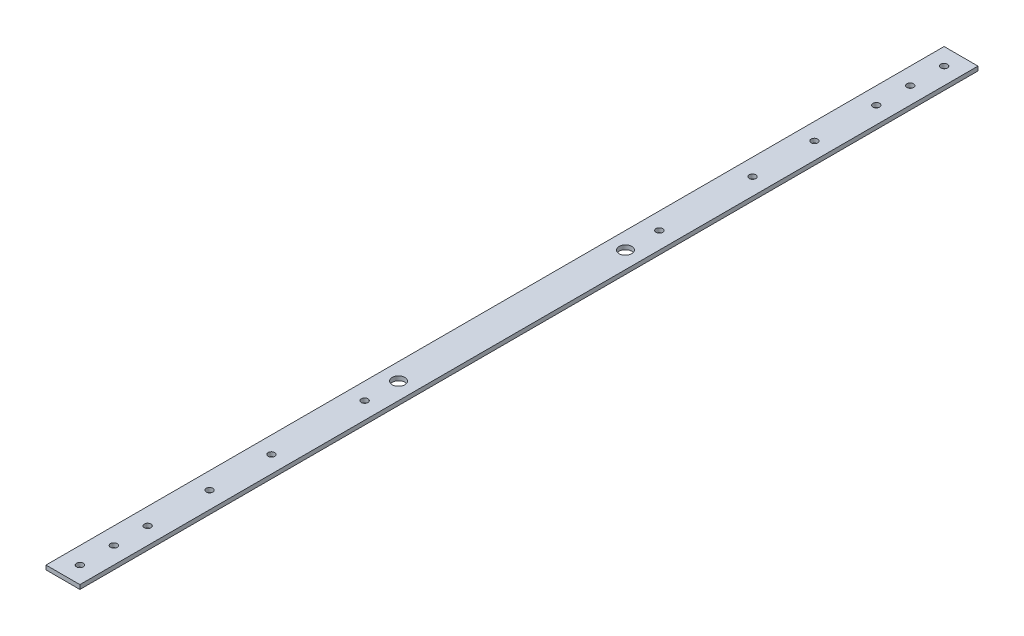
ISO-10303-21;
HEADER;
FILE_DESCRIPTION(('STEP AP214'),'2;1');
FILE_NAME('part.step','',(''),(''),'','','');
FILE_SCHEMA(('AUTOMOTIVE_DESIGN { 1 0 10303 214 1 1 1 1 }'));
ENDSEC;
DATA;
#1=APPLICATION_CONTEXT('core data for automotive mechanical design processes');
#2=APPLICATION_PROTOCOL_DEFINITION('international standard','automotive_design',2000,#1);
#3=PRODUCT_CONTEXT('',#1,'mechanical');
#4=PRODUCT('Part','Part','',(#3));
#5=PRODUCT_RELATED_PRODUCT_CATEGORY('part','',(#4));
#6=PRODUCT_DEFINITION_FORMATION('','',#4);
#7=PRODUCT_DEFINITION_CONTEXT('part definition',#1,'design');
#8=PRODUCT_DEFINITION('design','',#6,#7);
#9=PRODUCT_DEFINITION_SHAPE('','',#8);
#10=(LENGTH_UNIT() NAMED_UNIT(*) SI_UNIT(.MILLI.,.METRE.));
#11=(NAMED_UNIT(*) PLANE_ANGLE_UNIT() SI_UNIT($,.RADIAN.));
#12=(NAMED_UNIT(*) SI_UNIT($,.STERADIAN.) SOLID_ANGLE_UNIT());
#13=UNCERTAINTY_MEASURE_WITH_UNIT(LENGTH_MEASURE(1.E-05),#10,'distance_accuracy_value','');
#14=(GEOMETRIC_REPRESENTATION_CONTEXT(3) GLOBAL_UNCERTAINTY_ASSIGNED_CONTEXT((#13)) GLOBAL_UNIT_ASSIGNED_CONTEXT((#10,
#11,#12)) REPRESENTATION_CONTEXT('',''));
#15=CARTESIAN_POINT('',(0.,0.,0.));
#16=DIRECTION('',(0.,0.,1.));
#17=DIRECTION('',(1.,0.,0.));
#18=AXIS2_PLACEMENT_3D('',#15,#16,#17);
#19=CARTESIAN_POINT('',(31.7500000000001,500.126,-673.1));
#20=DIRECTION('',(0.,1.,0.));
#21=DIRECTION('',(-1.,0.,0.));
#22=AXIS2_PLACEMENT_3D('',#19,#20,#21);
#23=PLANE('',#22);
#24=DIRECTION('',(-1.,0.,0.));
#25=VECTOR('',#24,1.);
#26=CARTESIAN_POINT('',(31.7500000000001,500.126,0.));
#27=LINE('',#26,#25);
#28=CARTESIAN_POINT('',(57.1500000000001,500.126,0.));
#29=VERTEX_POINT('',#28);
#30=CARTESIAN_POINT('',(31.7500000000001,500.126,0.));
#31=VERTEX_POINT('',#30);
#32=EDGE_CURVE('E84',#29,#31,#27,.T.);
#33=ORIENTED_EDGE('',*,*,#32,.F.);
#34=DIRECTION('',(0.,0.,1.));
#35=VECTOR('',#34,1.);
#36=CARTESIAN_POINT('',(57.1500000000001,500.126,-673.1));
#37=LINE('',#36,#35);
#38=CARTESIAN_POINT('',(57.1500000000001,500.126,-673.1));
#39=VERTEX_POINT('',#38);
#40=EDGE_CURVE('E50',#39,#29,#37,.T.);
#41=ORIENTED_EDGE('',*,*,#40,.F.);
#42=DIRECTION('',(-1.,0.,0.));
#43=VECTOR('',#42,1.);
#44=CARTESIAN_POINT('',(31.7500000000001,500.126,-673.1));
#45=LINE('',#44,#43);
#46=CARTESIAN_POINT('',(31.7500000000001,500.126,-673.1));
#47=VERTEX_POINT('',#46);
#48=EDGE_CURVE('E86',#39,#47,#45,.T.);
#49=ORIENTED_EDGE('',*,*,#48,.T.);
#50=DIRECTION('',(0.,0.,1.));
#51=VECTOR('',#50,1.);
#52=CARTESIAN_POINT('',(31.7500000000001,500.126,-673.1));
#53=LINE('',#52,#51);
#54=EDGE_CURVE('E11',#47,#31,#53,.T.);
#55=ORIENTED_EDGE('',*,*,#54,.T.);
#56=EDGE_LOOP('',(#33,#41,#49,#55));
#57=FACE_BOUND('',#56,.T.);
#58=CARTESIAN_POINT('',(44.4500000000001,500.126,-226.1108));
#59=DIRECTION('',(0.,1.,0.));
#60=DIRECTION('',(-1.,0.,0.));
#61=AXIS2_PLACEMENT_3D('',#58,#59,#60);
#62=CIRCLE('',#61,2.48919999998114);
#63=CARTESIAN_POINT('',(41.9608000000189,500.126,-226.1108));
#64=VERTEX_POINT('',#63);
#65=EDGE_CURVE('E176',#64,#64,#62,.T.);
#66=ORIENTED_EDGE('',*,*,#65,.F.);
#67=EDGE_LOOP('',(#66));
#68=FACE_BOUND('',#67,.T.);
#69=CARTESIAN_POINT('',(44.4500000000001,500.126,-516.8392));
#70=DIRECTION('',(0.,1.,0.));
#71=DIRECTION('',(-1.,0.,0.));
#72=AXIS2_PLACEMENT_3D('',#69,#70,#71);
#73=CIRCLE('',#72,2.48919999999996);
#74=CARTESIAN_POINT('',(41.9608000000001,500.126,-516.8392));
#75=VERTEX_POINT('',#74);
#76=EDGE_CURVE('E180',#75,#75,#73,.T.);
#77=ORIENTED_EDGE('',*,*,#76,.F.);
#78=EDGE_LOOP('',(#77));
#79=FACE_BOUND('',#78,.T.);
#80=CARTESIAN_POINT('',(44.4500000000001,500.126,-446.9892));
#81=DIRECTION('',(0.,1.,0.));
#82=DIRECTION('',(-1.,0.,0.));
#83=AXIS2_PLACEMENT_3D('',#80,#81,#82);
#84=CIRCLE('',#83,2.4892);
#85=CARTESIAN_POINT('',(41.9608000000001,500.126,-446.9892));
#86=VERTEX_POINT('',#85);
#87=EDGE_CURVE('E184',#86,#86,#84,.T.);
#88=ORIENTED_EDGE('',*,*,#87,.F.);
#89=EDGE_LOOP('',(#88));
#90=FACE_BOUND('',#89,.T.);
#91=CARTESIAN_POINT('',(44.4500000000001,500.126,-63.5));
#92=DIRECTION('',(0.,1.,0.));
#93=DIRECTION('',(-1.,0.,0.));
#94=AXIS2_PLACEMENT_3D('',#91,#92,#93);
#95=CIRCLE('',#94,2.48919999998113);
#96=CARTESIAN_POINT('',(41.9608000000189,500.126,-63.5));
#97=VERTEX_POINT('',#96);
#98=EDGE_CURVE('E188',#97,#97,#95,.T.);
#99=ORIENTED_EDGE('',*,*,#98,.F.);
#100=EDGE_LOOP('',(#99));
#101=FACE_BOUND('',#100,.T.);
#102=CARTESIAN_POINT('',(44.4500000000001,500.126,-38.1));
#103=DIRECTION('',(0.,1.,0.));
#104=DIRECTION('',(-1.,0.,0.));
#105=AXIS2_PLACEMENT_3D('',#102,#103,#104);
#106=CIRCLE('',#105,2.48919999998114);
#107=CARTESIAN_POINT('',(41.9608000000189,500.126,-38.1));
#108=VERTEX_POINT('',#107);
#109=EDGE_CURVE('E167',#108,#108,#106,.T.);
#110=ORIENTED_EDGE('',*,*,#109,.F.);
#111=EDGE_LOOP('',(#110));
#112=FACE_BOUND('',#111,.T.);
#113=CARTESIAN_POINT('',(44.4500000000001,500.126,-660.4));
#114=DIRECTION('',(0.,1.,0.));
#115=DIRECTION('',(-1.,0.,0.));
#116=AXIS2_PLACEMENT_3D('',#113,#114,#115);
#117=CIRCLE('',#116,2.48919999999997);
#118=CARTESIAN_POINT('',(41.9608000000001,500.126,-660.4));
#119=VERTEX_POINT('',#118);
#120=EDGE_CURVE('E163',#119,#119,#117,.T.);
#121=ORIENTED_EDGE('',*,*,#120,.F.);
#122=EDGE_LOOP('',(#121));
#123=FACE_BOUND('',#122,.T.);
#124=CARTESIAN_POINT('',(44.4500000000001,500.126,-156.2608));
#125=DIRECTION('',(0.,1.,0.));
#126=DIRECTION('',(-1.,0.,0.));
#127=AXIS2_PLACEMENT_3D('',#124,#125,#126);
#128=CIRCLE('',#127,2.4892);
#129=CARTESIAN_POINT('',(41.9608000000001,500.126,-156.2608));
#130=VERTEX_POINT('',#129);
#131=EDGE_CURVE('E168',#130,#130,#128,.T.);
#132=ORIENTED_EDGE('',*,*,#131,.F.);
#133=EDGE_LOOP('',(#132));
#134=FACE_BOUND('',#133,.T.);
#135=CARTESIAN_POINT('',(44.4500000000001,500.126,-635.));
#136=DIRECTION('',(0.,1.,0.));
#137=DIRECTION('',(-1.,0.,0.));
#138=AXIS2_PLACEMENT_3D('',#135,#136,#137);
#139=CIRCLE('',#138,2.48919999999997);
#140=CARTESIAN_POINT('',(41.9608000000001,500.126,-635.));
#141=VERTEX_POINT('',#140);
#142=EDGE_CURVE('E172',#141,#141,#139,.T.);
#143=ORIENTED_EDGE('',*,*,#142,.F.);
#144=EDGE_LOOP('',(#143));
#145=FACE_BOUND('',#144,.T.);
#146=CARTESIAN_POINT('',(44.4500000000001,500.126,-609.6));
#147=DIRECTION('',(0.,1.,0.));
#148=DIRECTION('',(-1.,0.,0.));
#149=AXIS2_PLACEMENT_3D('',#146,#147,#148);
#150=CIRCLE('',#149,2.48919999999997);
#151=CARTESIAN_POINT('',(41.9608000000001,500.126,-609.6));
#152=VERTEX_POINT('',#151);
#153=EDGE_CURVE('E192',#152,#152,#150,.T.);
#154=ORIENTED_EDGE('',*,*,#153,.F.);
#155=EDGE_LOOP('',(#154));
#156=FACE_BOUND('',#155,.T.);
#157=CARTESIAN_POINT('',(44.4500000000001,500.126,-109.8804));
#158=DIRECTION('',(0.,1.,0.));
#159=DIRECTION('',(-1.,0.,0.));
#160=AXIS2_PLACEMENT_3D('',#157,#158,#159);
#161=CIRCLE('',#160,2.48919999998114);
#162=CARTESIAN_POINT('',(41.9608000000189,500.126,-109.8804));
#163=VERTEX_POINT('',#162);
#164=EDGE_CURVE('E196',#163,#163,#161,.T.);
#165=ORIENTED_EDGE('',*,*,#164,.F.);
#166=EDGE_LOOP('',(#165));
#167=FACE_BOUND('',#166,.T.);
#168=CARTESIAN_POINT('',(44.4500000000001,500.126,-12.7));
#169=DIRECTION('',(0.,1.,0.));
#170=DIRECTION('',(-1.,0.,0.));
#171=AXIS2_PLACEMENT_3D('',#168,#169,#170);
#172=CIRCLE('',#171,2.48919999998114);
#173=CARTESIAN_POINT('',(41.9608000000189,500.126,-12.7));
#174=VERTEX_POINT('',#173);
#175=EDGE_CURVE('E162',#174,#174,#172,.T.);
#176=ORIENTED_EDGE('',*,*,#175,.F.);
#177=EDGE_LOOP('',(#176));
#178=FACE_BOUND('',#177,.T.);
#179=CARTESIAN_POINT('',(44.4500000000001,500.126,-421.5892));
#180=DIRECTION('',(0.,1.,0.));
#181=DIRECTION('',(-1.,0.,0.));
#182=AXIS2_PLACEMENT_3D('',#179,#180,#181);
#183=CIRCLE('',#182,4.7625);
#184=CARTESIAN_POINT('',(39.6875000000001,500.126,-421.5892));
#185=VERTEX_POINT('',#184);
#186=EDGE_CURVE('E211',#185,#185,#183,.T.);
#187=ORIENTED_EDGE('',*,*,#186,.F.);
#188=EDGE_LOOP('',(#187));
#189=FACE_BOUND('',#188,.T.);
#190=CARTESIAN_POINT('',(44.4500000000001,500.126,-251.5108));
#191=DIRECTION('',(0.,1.,0.));
#192=DIRECTION('',(-1.,0.,0.));
#193=AXIS2_PLACEMENT_3D('',#190,#191,#192);
#194=CIRCLE('',#193,4.7625);
#195=CARTESIAN_POINT('',(39.6875000000001,500.126,-251.5108));
#196=VERTEX_POINT('',#195);
#197=EDGE_CURVE('E216',#196,#196,#194,.T.);
#198=ORIENTED_EDGE('',*,*,#197,.F.);
#199=EDGE_LOOP('',(#198));
#200=FACE_BOUND('',#199,.T.);
#201=CARTESIAN_POINT('',(44.4500000000001,500.126,-563.2196));
#202=DIRECTION('',(0.,-1.,0.));
#203=DIRECTION('',(-1.,0.,0.));
#204=AXIS2_PLACEMENT_3D('',#201,#202,#203);
#205=CIRCLE('',#204,2.48919999998114);
#206=CARTESIAN_POINT('',(41.9608000000189,500.126,-563.2196));
#207=VERTEX_POINT('',#206);
#208=EDGE_CURVE('E226',#207,#207,#205,.T.);
#209=ORIENTED_EDGE('',*,*,#208,.T.);
#210=EDGE_LOOP('',(#209));
#211=FACE_BOUND('',#210,.T.);
#212=ADVANCED_FACE('F46',(#57,#68,#79,#90,#101,#112,#123,#134,#145,#156,#167,#178,#189,#200,
#211),#23,.T.);
#213=CARTESIAN_POINT('',(31.7500000000001,496.951,-673.1));
#214=DIRECTION('',(0.,1.,0.));
#215=DIRECTION('',(-1.,0.,0.));
#216=AXIS2_PLACEMENT_3D('',#213,#214,#215);
#217=PLANE('',#216);
#218=CARTESIAN_POINT('',(44.4500000000001,496.951,-251.5108));
#219=DIRECTION('',(0.,1.,0.));
#220=DIRECTION('',(-1.,0.,0.));
#221=AXIS2_PLACEMENT_3D('',#218,#219,#220);
#222=CIRCLE('',#221,4.7625);
#223=CARTESIAN_POINT('',(39.6875000000001,496.951,-251.5108));
#224=VERTEX_POINT('',#223);
#225=EDGE_CURVE('E200',#224,#224,#222,.T.);
#226=ORIENTED_EDGE('',*,*,#225,.T.);
#227=EDGE_LOOP('',(#226));
#228=FACE_BOUND('',#227,.T.);
#229=CARTESIAN_POINT('',(44.4500000000001,496.951,-421.5892));
#230=DIRECTION('',(0.,1.,0.));
#231=DIRECTION('',(-1.,0.,0.));
#232=AXIS2_PLACEMENT_3D('',#229,#230,#231);
#233=CIRCLE('',#232,4.7625);
#234=CARTESIAN_POINT('',(39.6875000000001,496.951,-421.5892));
#235=VERTEX_POINT('',#234);
#236=EDGE_CURVE('E207',#235,#235,#233,.T.);
#237=ORIENTED_EDGE('',*,*,#236,.T.);
#238=EDGE_LOOP('',(#237));
#239=FACE_BOUND('',#238,.T.);
#240=CARTESIAN_POINT('',(44.4500000000001,496.951,-12.7));
#241=DIRECTION('',(0.,1.,0.));
#242=DIRECTION('',(-1.,0.,0.));
#243=AXIS2_PLACEMENT_3D('',#240,#241,#242);
#244=CIRCLE('',#243,2.48919999998114);
#245=CARTESIAN_POINT('',(41.9608000000189,496.951,-12.7));
#246=VERTEX_POINT('',#245);
#247=EDGE_CURVE('E118',#246,#246,#244,.T.);
#248=ORIENTED_EDGE('',*,*,#247,.T.);
#249=EDGE_LOOP('',(#248));
#250=FACE_BOUND('',#249,.T.);
#251=CARTESIAN_POINT('',(44.4500000000001,496.951,-109.8804));
#252=DIRECTION('',(0.,1.,0.));
#253=DIRECTION('',(-1.,0.,0.));
#254=AXIS2_PLACEMENT_3D('',#251,#252,#253);
#255=CIRCLE('',#254,2.48919999998114);
#256=CARTESIAN_POINT('',(41.9608000000189,496.951,-109.8804));
#257=VERTEX_POINT('',#256);
#258=EDGE_CURVE('E122',#257,#257,#255,.T.);
#259=ORIENTED_EDGE('',*,*,#258,.T.);
#260=EDGE_LOOP('',(#259));
#261=FACE_BOUND('',#260,.T.);
#262=CARTESIAN_POINT('',(44.4500000000001,496.951,-609.6));
#263=DIRECTION('',(0.,1.,0.));
#264=DIRECTION('',(-1.,0.,0.));
#265=AXIS2_PLACEMENT_3D('',#262,#263,#264);
#266=CIRCLE('',#265,2.48919999999997);
#267=CARTESIAN_POINT('',(41.9608000000001,496.951,-609.6));
#268=VERTEX_POINT('',#267);
#269=EDGE_CURVE('E126',#268,#268,#266,.T.);
#270=ORIENTED_EDGE('',*,*,#269,.T.);
#271=EDGE_LOOP('',(#270));
#272=FACE_BOUND('',#271,.T.);
#273=CARTESIAN_POINT('',(44.4500000000001,496.951,-635.));
#274=DIRECTION('',(0.,1.,0.));
#275=DIRECTION('',(-1.,0.,0.));
#276=AXIS2_PLACEMENT_3D('',#273,#274,#275);
#277=CIRCLE('',#276,2.48919999999997);
#278=CARTESIAN_POINT('',(41.9608000000001,496.951,-635.));
#279=VERTEX_POINT('',#278);
#280=EDGE_CURVE('E130',#279,#279,#277,.T.);
#281=ORIENTED_EDGE('',*,*,#280,.T.);
#282=EDGE_LOOP('',(#281));
#283=FACE_BOUND('',#282,.T.);
#284=CARTESIAN_POINT('',(44.4500000000001,496.951,-156.2608));
#285=DIRECTION('',(0.,1.,0.));
#286=DIRECTION('',(-1.,0.,0.));
#287=AXIS2_PLACEMENT_3D('',#284,#285,#286);
#288=CIRCLE('',#287,2.4892);
#289=CARTESIAN_POINT('',(41.9608000000001,496.951,-156.2608));
#290=VERTEX_POINT('',#289);
#291=EDGE_CURVE('E134',#290,#290,#288,.T.);
#292=ORIENTED_EDGE('',*,*,#291,.T.);
#293=EDGE_LOOP('',(#292));
#294=FACE_BOUND('',#293,.T.);
#295=CARTESIAN_POINT('',(44.4500000000001,496.951,-660.4));
#296=DIRECTION('',(0.,1.,0.));
#297=DIRECTION('',(-1.,0.,0.));
#298=AXIS2_PLACEMENT_3D('',#295,#296,#297);
#299=CIRCLE('',#298,2.48919999999997);
#300=CARTESIAN_POINT('',(41.9608000000001,496.951,-660.4));
#301=VERTEX_POINT('',#300);
#302=EDGE_CURVE('E138',#301,#301,#299,.T.);
#303=ORIENTED_EDGE('',*,*,#302,.T.);
#304=EDGE_LOOP('',(#303));
#305=FACE_BOUND('',#304,.T.);
#306=CARTESIAN_POINT('',(44.4500000000001,496.951,-38.1));
#307=DIRECTION('',(0.,1.,0.));
#308=DIRECTION('',(-1.,0.,0.));
#309=AXIS2_PLACEMENT_3D('',#306,#307,#308);
#310=CIRCLE('',#309,2.48919999998114);
#311=CARTESIAN_POINT('',(41.9608000000189,496.951,-38.1));
#312=VERTEX_POINT('',#311);
#313=EDGE_CURVE('E142',#312,#312,#310,.T.);
#314=ORIENTED_EDGE('',*,*,#313,.T.);
#315=EDGE_LOOP('',(#314));
#316=FACE_BOUND('',#315,.T.);
#317=CARTESIAN_POINT('',(44.4500000000001,496.951,-63.5));
#318=DIRECTION('',(0.,1.,0.));
#319=DIRECTION('',(-1.,0.,0.));
#320=AXIS2_PLACEMENT_3D('',#317,#318,#319);
#321=CIRCLE('',#320,2.48919999998113);
#322=CARTESIAN_POINT('',(41.9608000000189,496.951,-63.5));
#323=VERTEX_POINT('',#322);
#324=EDGE_CURVE('E146',#323,#323,#321,.T.);
#325=ORIENTED_EDGE('',*,*,#324,.T.);
#326=EDGE_LOOP('',(#325));
#327=FACE_BOUND('',#326,.T.);
#328=CARTESIAN_POINT('',(44.4500000000001,496.951,-446.9892));
#329=DIRECTION('',(0.,1.,0.));
#330=DIRECTION('',(-1.,0.,0.));
#331=AXIS2_PLACEMENT_3D('',#328,#329,#330);
#332=CIRCLE('',#331,2.4892);
#333=CARTESIAN_POINT('',(41.9608000000001,496.951,-446.9892));
#334=VERTEX_POINT('',#333);
#335=EDGE_CURVE('E150',#334,#334,#332,.T.);
#336=ORIENTED_EDGE('',*,*,#335,.T.);
#337=EDGE_LOOP('',(#336));
#338=FACE_BOUND('',#337,.T.);
#339=CARTESIAN_POINT('',(44.4500000000001,496.951,-516.8392));
#340=DIRECTION('',(0.,1.,0.));
#341=DIRECTION('',(-1.,0.,0.));
#342=AXIS2_PLACEMENT_3D('',#339,#340,#341);
#343=CIRCLE('',#342,2.48919999999996);
#344=CARTESIAN_POINT('',(41.9608000000001,496.951,-516.8392));
#345=VERTEX_POINT('',#344);
#346=EDGE_CURVE('E154',#345,#345,#343,.T.);
#347=ORIENTED_EDGE('',*,*,#346,.T.);
#348=EDGE_LOOP('',(#347));
#349=FACE_BOUND('',#348,.T.);
#350=CARTESIAN_POINT('',(44.4500000000001,496.951,-226.1108));
#351=DIRECTION('',(0.,1.,0.));
#352=DIRECTION('',(-1.,0.,0.));
#353=AXIS2_PLACEMENT_3D('',#350,#351,#352);
#354=CIRCLE('',#353,2.48919999998114);
#355=CARTESIAN_POINT('',(41.9608000000189,496.951,-226.1108));
#356=VERTEX_POINT('',#355);
#357=EDGE_CURVE('E158',#356,#356,#354,.T.);
#358=ORIENTED_EDGE('',*,*,#357,.T.);
#359=EDGE_LOOP('',(#358));
#360=FACE_BOUND('',#359,.T.);
#361=DIRECTION('',(-1.,0.,0.));
#362=VECTOR('',#361,1.);
#363=CARTESIAN_POINT('',(-2.17215134767912E-12,496.951,0.));
#364=LINE('',#363,#362);
#365=CARTESIAN_POINT('',(57.1500000000001,496.951,0.));
#366=VERTEX_POINT('',#365);
#367=CARTESIAN_POINT('',(31.7500000000001,496.951,0.));
#368=VERTEX_POINT('',#367);
#369=EDGE_CURVE('E62',#366,#368,#364,.T.);
#370=ORIENTED_EDGE('',*,*,#369,.T.);
#371=DIRECTION('',(0.,0.,1.));
#372=VECTOR('',#371,1.);
#373=CARTESIAN_POINT('',(31.7500000000001,496.951,0.));
#374=LINE('',#373,#372);
#375=CARTESIAN_POINT('',(31.7500000000001,496.951,-673.1));
#376=VERTEX_POINT('',#375);
#377=EDGE_CURVE('E90',#376,#368,#374,.T.);
#378=ORIENTED_EDGE('',*,*,#377,.F.);
#379=DIRECTION('',(-1.,0.,0.));
#380=VECTOR('',#379,1.);
#381=CARTESIAN_POINT('',(-2.17215134767912E-12,496.951,-673.1));
#382=LINE('',#381,#380);
#383=CARTESIAN_POINT('',(57.1500000000001,496.951,-673.1));
#384=VERTEX_POINT('',#383);
#385=EDGE_CURVE('E93',#384,#376,#382,.T.);
#386=ORIENTED_EDGE('',*,*,#385,.F.);
#387=DIRECTION('',(0.,0.,1.));
#388=VECTOR('',#387,1.);
#389=CARTESIAN_POINT('',(57.1500000000001,496.951,0.));
#390=LINE('',#389,#388);
#391=EDGE_CURVE('E230',#384,#366,#390,.T.);
#392=ORIENTED_EDGE('',*,*,#391,.T.);
#393=EDGE_LOOP('',(#370,#378,#386,#392));
#394=FACE_BOUND('',#393,.T.);
#395=CARTESIAN_POINT('',(44.4500000000001,496.951,-563.2196));
#396=DIRECTION('',(0.,1.,0.));
#397=DIRECTION('',(-1.,0.,0.));
#398=AXIS2_PLACEMENT_3D('',#395,#396,#397);
#399=CIRCLE('',#398,2.48919999998114);
#400=CARTESIAN_POINT('',(41.9608000000189,496.951,-563.2196));
#401=VERTEX_POINT('',#400);
#402=EDGE_CURVE('E212',#401,#401,#399,.F.);
#403=ORIENTED_EDGE('',*,*,#402,.F.);
#404=EDGE_LOOP('',(#403));
#405=FACE_BOUND('',#404,.T.);
#406=ADVANCED_FACE('F325',(#228,#239,#250,#261,#272,#283,#294,#305,#316,#327,#338,#349,#360,
#394,#405),#217,.F.);
#407=CARTESIAN_POINT('',(31.7500000000001,500.126,-673.1));
#408=DIRECTION('',(-1.,0.,0.));
#409=DIRECTION('',(0.,0.,1.));
#410=AXIS2_PLACEMENT_3D('',#407,#408,#409);
#411=PLANE('',#410);
#412=ORIENTED_EDGE('',*,*,#377,.T.);
#413=DIRECTION('',(0.,-1.,0.));
#414=VECTOR('',#413,1.);
#415=CARTESIAN_POINT('',(31.7500000000001,500.126,0.));
#416=LINE('',#415,#414);
#417=EDGE_CURVE('E88',#31,#368,#416,.T.);
#418=ORIENTED_EDGE('',*,*,#417,.F.);
#419=ORIENTED_EDGE('',*,*,#54,.F.);
#420=DIRECTION('',(0.,-1.,0.));
#421=VECTOR('',#420,1.);
#422=CARTESIAN_POINT('',(31.7500000000001,500.126,-673.1));
#423=LINE('',#422,#421);
#424=EDGE_CURVE('E99',#47,#376,#423,.T.);
#425=ORIENTED_EDGE('',*,*,#424,.T.);
#426=EDGE_LOOP('',(#412,#418,#419,#425));
#427=FACE_BOUND('',#426,.T.);
#428=ADVANCED_FACE('F48',(#427),#411,.T.);
#429=CARTESIAN_POINT('',(57.1500000000001,500.126,-673.1));
#430=DIRECTION('',(1.,0.,0.));
#431=DIRECTION('',(0.,1.,0.));
#432=AXIS2_PLACEMENT_3D('',#429,#430,#431);
#433=PLANE('',#432);
#434=ORIENTED_EDGE('',*,*,#391,.F.);
#435=DIRECTION('',(0.,1.,0.));
#436=VECTOR('',#435,1.);
#437=CARTESIAN_POINT('',(57.1500000000001,500.126,-673.1));
#438=LINE('',#437,#436);
#439=EDGE_CURVE('E105',#384,#39,#438,.T.);
#440=ORIENTED_EDGE('',*,*,#439,.T.);
#441=ORIENTED_EDGE('',*,*,#40,.T.);
#442=DIRECTION('',(0.,1.,0.));
#443=VECTOR('',#442,1.);
#444=CARTESIAN_POINT('',(57.1500000000001,500.126,0.));
#445=LINE('',#444,#443);
#446=EDGE_CURVE('E92',#366,#29,#445,.T.);
#447=ORIENTED_EDGE('',*,*,#446,.F.);
#448=EDGE_LOOP('',(#434,#440,#441,#447));
#449=FACE_BOUND('',#448,.T.);
#450=ADVANCED_FACE('F315',(#449),#433,.T.);
#451=CARTESIAN_POINT('',(0.,0.,-673.1));
#452=DIRECTION('',(0.,0.,1.));
#453=DIRECTION('',(1.,0.,0.));
#454=AXIS2_PLACEMENT_3D('',#451,#452,#453);
#455=PLANE('',#454);
#456=ORIENTED_EDGE('',*,*,#439,.F.);
#457=ORIENTED_EDGE('',*,*,#385,.T.);
#458=ORIENTED_EDGE('',*,*,#424,.F.);
#459=ORIENTED_EDGE('',*,*,#48,.F.);
#460=EDGE_LOOP('',(#456,#457,#458,#459));
#461=FACE_BOUND('',#460,.T.);
#462=ADVANCED_FACE('F318',(#461),#455,.F.);
#463=CARTESIAN_POINT('',(0.,0.,0.));
#464=DIRECTION('',(0.,0.,1.));
#465=DIRECTION('',(1.,0.,0.));
#466=AXIS2_PLACEMENT_3D('',#463,#464,#465);
#467=PLANE('',#466);
#468=ORIENTED_EDGE('',*,*,#369,.F.);
#469=ORIENTED_EDGE('',*,*,#446,.T.);
#470=ORIENTED_EDGE('',*,*,#32,.T.);
#471=ORIENTED_EDGE('',*,*,#417,.T.);
#472=EDGE_LOOP('',(#468,#469,#470,#471));
#473=FACE_BOUND('',#472,.T.);
#474=ADVANCED_FACE('F95',(#473),#467,.T.);
#475=CARTESIAN_POINT('',(44.45,474.726,-226.1108));
#476=DIRECTION('',(0.,1.,0.));
#477=DIRECTION('',(-1.,0.,0.));
#478=AXIS2_PLACEMENT_3D('',#475,#476,#477);
#479=CYLINDRICAL_SURFACE('',#478,2.48919999998114);
#480=ORIENTED_EDGE('',*,*,#65,.T.);
#481=EDGE_LOOP('',(#480));
#482=FACE_BOUND('',#481,.T.);
#483=ORIENTED_EDGE('',*,*,#357,.F.);
#484=EDGE_LOOP('',(#483));
#485=FACE_BOUND('',#484,.T.);
#486=ADVANCED_FACE('F494',(#482,#485),#479,.F.);
#487=CARTESIAN_POINT('',(44.45,474.726,-516.8392));
#488=DIRECTION('',(0.,1.,0.));
#489=DIRECTION('',(-1.,0.,0.));
#490=AXIS2_PLACEMENT_3D('',#487,#488,#489);
#491=CYLINDRICAL_SURFACE('',#490,2.48919999999996);
#492=ORIENTED_EDGE('',*,*,#76,.T.);
#493=EDGE_LOOP('',(#492));
#494=FACE_BOUND('',#493,.T.);
#495=ORIENTED_EDGE('',*,*,#346,.F.);
#496=EDGE_LOOP('',(#495));
#497=FACE_BOUND('',#496,.T.);
#498=ADVANCED_FACE('F484',(#494,#497),#491,.F.);
#499=CARTESIAN_POINT('',(44.45,474.726,-446.9892));
#500=DIRECTION('',(0.,1.,0.));
#501=DIRECTION('',(-1.,0.,0.));
#502=AXIS2_PLACEMENT_3D('',#499,#500,#501);
#503=CYLINDRICAL_SURFACE('',#502,2.4892);
#504=ORIENTED_EDGE('',*,*,#87,.T.);
#505=EDGE_LOOP('',(#504));
#506=FACE_BOUND('',#505,.T.);
#507=ORIENTED_EDGE('',*,*,#335,.F.);
#508=EDGE_LOOP('',(#507));
#509=FACE_BOUND('',#508,.T.);
#510=ADVANCED_FACE('F474',(#506,#509),#503,.F.);
#511=CARTESIAN_POINT('',(44.45,474.726,-63.5));
#512=DIRECTION('',(0.,1.,0.));
#513=DIRECTION('',(-1.,0.,0.));
#514=AXIS2_PLACEMENT_3D('',#511,#512,#513);
#515=CYLINDRICAL_SURFACE('',#514,2.48919999998113);
#516=ORIENTED_EDGE('',*,*,#98,.T.);
#517=EDGE_LOOP('',(#516));
#518=FACE_BOUND('',#517,.T.);
#519=ORIENTED_EDGE('',*,*,#324,.F.);
#520=EDGE_LOOP('',(#519));
#521=FACE_BOUND('',#520,.T.);
#522=ADVANCED_FACE('F464',(#518,#521),#515,.F.);
#523=CARTESIAN_POINT('',(44.45,474.726,-38.1));
#524=DIRECTION('',(0.,1.,0.));
#525=DIRECTION('',(-1.,0.,0.));
#526=AXIS2_PLACEMENT_3D('',#523,#524,#525);
#527=CYLINDRICAL_SURFACE('',#526,2.48919999998114);
#528=ORIENTED_EDGE('',*,*,#109,.T.);
#529=EDGE_LOOP('',(#528));
#530=FACE_BOUND('',#529,.T.);
#531=ORIENTED_EDGE('',*,*,#313,.F.);
#532=EDGE_LOOP('',(#531));
#533=FACE_BOUND('',#532,.T.);
#534=ADVANCED_FACE('F454',(#530,#533),#527,.F.);
#535=CARTESIAN_POINT('',(44.45,474.726,-660.4));
#536=DIRECTION('',(0.,1.,0.));
#537=DIRECTION('',(-1.,0.,0.));
#538=AXIS2_PLACEMENT_3D('',#535,#536,#537);
#539=CYLINDRICAL_SURFACE('',#538,2.48919999999997);
#540=ORIENTED_EDGE('',*,*,#120,.T.);
#541=EDGE_LOOP('',(#540));
#542=FACE_BOUND('',#541,.T.);
#543=ORIENTED_EDGE('',*,*,#302,.F.);
#544=EDGE_LOOP('',(#543));
#545=FACE_BOUND('',#544,.T.);
#546=ADVANCED_FACE('F444',(#542,#545),#539,.F.);
#547=CARTESIAN_POINT('',(44.45,474.726,-156.2608));
#548=DIRECTION('',(0.,1.,0.));
#549=DIRECTION('',(-1.,0.,0.));
#550=AXIS2_PLACEMENT_3D('',#547,#548,#549);
#551=CYLINDRICAL_SURFACE('',#550,2.4892);
#552=ORIENTED_EDGE('',*,*,#131,.T.);
#553=EDGE_LOOP('',(#552));
#554=FACE_BOUND('',#553,.T.);
#555=ORIENTED_EDGE('',*,*,#291,.F.);
#556=EDGE_LOOP('',(#555));
#557=FACE_BOUND('',#556,.T.);
#558=ADVANCED_FACE('F434',(#554,#557),#551,.F.);
#559=CARTESIAN_POINT('',(44.45,474.726,-635.));
#560=DIRECTION('',(0.,1.,0.));
#561=DIRECTION('',(-1.,0.,0.));
#562=AXIS2_PLACEMENT_3D('',#559,#560,#561);
#563=CYLINDRICAL_SURFACE('',#562,2.48919999999997);
#564=ORIENTED_EDGE('',*,*,#142,.T.);
#565=EDGE_LOOP('',(#564));
#566=FACE_BOUND('',#565,.T.);
#567=ORIENTED_EDGE('',*,*,#280,.F.);
#568=EDGE_LOOP('',(#567));
#569=FACE_BOUND('',#568,.T.);
#570=ADVANCED_FACE('F424',(#566,#569),#563,.F.);
#571=CARTESIAN_POINT('',(44.45,474.726,-609.6));
#572=DIRECTION('',(0.,1.,0.));
#573=DIRECTION('',(-1.,0.,0.));
#574=AXIS2_PLACEMENT_3D('',#571,#572,#573);
#575=CYLINDRICAL_SURFACE('',#574,2.48919999999997);
#576=ORIENTED_EDGE('',*,*,#153,.T.);
#577=EDGE_LOOP('',(#576));
#578=FACE_BOUND('',#577,.T.);
#579=ORIENTED_EDGE('',*,*,#269,.F.);
#580=EDGE_LOOP('',(#579));
#581=FACE_BOUND('',#580,.T.);
#582=ADVANCED_FACE('F414',(#578,#581),#575,.F.);
#583=CARTESIAN_POINT('',(44.45,474.726,-109.8804));
#584=DIRECTION('',(0.,1.,0.));
#585=DIRECTION('',(-1.,0.,0.));
#586=AXIS2_PLACEMENT_3D('',#583,#584,#585);
#587=CYLINDRICAL_SURFACE('',#586,2.48919999998114);
#588=ORIENTED_EDGE('',*,*,#164,.T.);
#589=EDGE_LOOP('',(#588));
#590=FACE_BOUND('',#589,.T.);
#591=ORIENTED_EDGE('',*,*,#258,.F.);
#592=EDGE_LOOP('',(#591));
#593=FACE_BOUND('',#592,.T.);
#594=ADVANCED_FACE('F404',(#590,#593),#587,.F.);
#595=CARTESIAN_POINT('',(44.45,474.726,-12.7));
#596=DIRECTION('',(0.,1.,0.));
#597=DIRECTION('',(-1.,0.,0.));
#598=AXIS2_PLACEMENT_3D('',#595,#596,#597);
#599=CYLINDRICAL_SURFACE('',#598,2.48919999998114);
#600=ORIENTED_EDGE('',*,*,#175,.T.);
#601=EDGE_LOOP('',(#600));
#602=FACE_BOUND('',#601,.T.);
#603=ORIENTED_EDGE('',*,*,#247,.F.);
#604=EDGE_LOOP('',(#603));
#605=FACE_BOUND('',#604,.T.);
#606=ADVANCED_FACE('F394',(#602,#605),#599,.F.);
#607=CARTESIAN_POINT('',(44.4500000000001,496.951,-421.5892));
#608=DIRECTION('',(0.,1.,0.));
#609=DIRECTION('',(-1.,0.,0.));
#610=AXIS2_PLACEMENT_3D('',#607,#608,#609);
#611=CYLINDRICAL_SURFACE('',#610,4.7625);
#612=ORIENTED_EDGE('',*,*,#236,.F.);
#613=EDGE_LOOP('',(#612));
#614=FACE_BOUND('',#613,.T.);
#615=ORIENTED_EDGE('',*,*,#186,.T.);
#616=EDGE_LOOP('',(#615));
#617=FACE_BOUND('',#616,.T.);
#618=ADVANCED_FACE('F341',(#614,#617),#611,.F.);
#619=CARTESIAN_POINT('',(44.4500000000001,496.951,-251.5108));
#620=DIRECTION('',(0.,1.,0.));
#621=DIRECTION('',(-1.,0.,0.));
#622=AXIS2_PLACEMENT_3D('',#619,#620,#621);
#623=CYLINDRICAL_SURFACE('',#622,4.7625);
#624=ORIENTED_EDGE('',*,*,#225,.F.);
#625=EDGE_LOOP('',(#624));
#626=FACE_BOUND('',#625,.T.);
#627=ORIENTED_EDGE('',*,*,#197,.T.);
#628=EDGE_LOOP('',(#627));
#629=FACE_BOUND('',#628,.T.);
#630=ADVANCED_FACE('F334',(#626,#629),#623,.F.);
#631=CARTESIAN_POINT('',(44.45,474.726,-563.2196));
#632=DIRECTION('',(0.,1.,0.));
#633=DIRECTION('',(-1.,0.,0.));
#634=AXIS2_PLACEMENT_3D('',#631,#632,#633);
#635=CYLINDRICAL_SURFACE('',#634,2.48919999998114);
#636=ORIENTED_EDGE('',*,*,#208,.F.);
#637=EDGE_LOOP('',(#636));
#638=FACE_BOUND('',#637,.T.);
#639=ORIENTED_EDGE('',*,*,#402,.T.);
#640=EDGE_LOOP('',(#639));
#641=FACE_BOUND('',#640,.T.);
#642=ADVANCED_FACE('F332',(#638,#641),#635,.F.);
#643=CLOSED_SHELL('',(#212,#406,#428,#450,#462,#474,#486,#498,#510,#522,#534,#546,#558,#570,
#582,#594,#606,#618,#630,#642));
#644=MANIFOLD_SOLID_BREP('B2',#643);
#645=ADVANCED_BREP_SHAPE_REPRESENTATION('',(#18,#644),#14);
#646=SHAPE_DEFINITION_REPRESENTATION(#9,#645);
ENDSEC;
END-ISO-10303-21;
